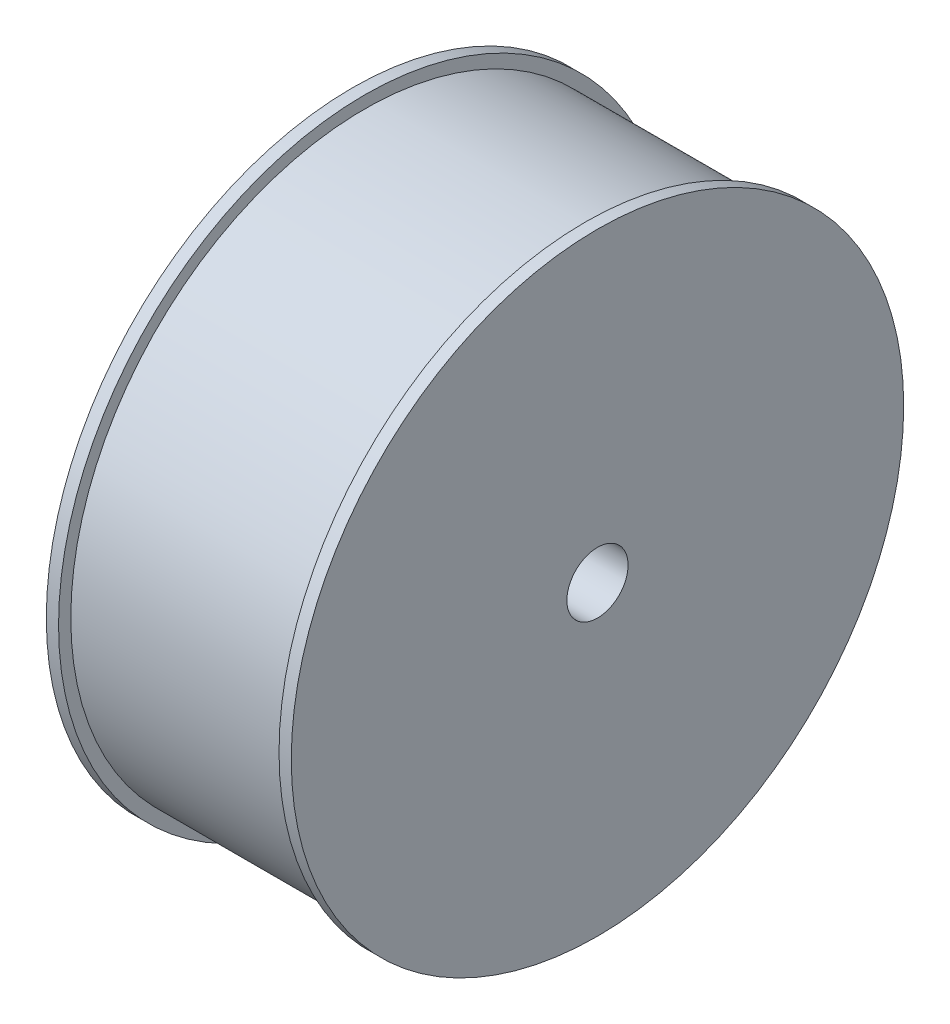
ISO-10303-21;
HEADER;
FILE_DESCRIPTION(('STEP AP214'),'2;1');
FILE_NAME('part.step','',(''),(''),'','','');
FILE_SCHEMA(('AUTOMOTIVE_DESIGN { 1 0 10303 214 1 1 1 1 }'));
ENDSEC;
DATA;
#1=APPLICATION_CONTEXT('core data for automotive mechanical design processes');
#2=APPLICATION_PROTOCOL_DEFINITION('international standard','automotive_design',2000,#1);
#3=PRODUCT_CONTEXT('',#1,'mechanical');
#4=PRODUCT('Part','Part','',(#3));
#5=PRODUCT_RELATED_PRODUCT_CATEGORY('part','',(#4));
#6=PRODUCT_DEFINITION_FORMATION('','',#4);
#7=PRODUCT_DEFINITION_CONTEXT('part definition',#1,'design');
#8=PRODUCT_DEFINITION('design','',#6,#7);
#9=PRODUCT_DEFINITION_SHAPE('','',#8);
#10=(LENGTH_UNIT() NAMED_UNIT(*) SI_UNIT(.MILLI.,.METRE.));
#11=(NAMED_UNIT(*) PLANE_ANGLE_UNIT() SI_UNIT($,.RADIAN.));
#12=(NAMED_UNIT(*) SI_UNIT($,.STERADIAN.) SOLID_ANGLE_UNIT());
#13=UNCERTAINTY_MEASURE_WITH_UNIT(LENGTH_MEASURE(1.E-05),#10,'distance_accuracy_value','');
#14=(GEOMETRIC_REPRESENTATION_CONTEXT(3) GLOBAL_UNCERTAINTY_ASSIGNED_CONTEXT((#13)) GLOBAL_UNIT_ASSIGNED_CONTEXT((#10,
#11,#12)) REPRESENTATION_CONTEXT('',''));
#15=CARTESIAN_POINT('',(0.,0.,0.));
#16=DIRECTION('',(0.,0.,1.));
#17=DIRECTION('',(1.,0.,0.));
#18=AXIS2_PLACEMENT_3D('',#15,#16,#17);
#19=CARTESIAN_POINT('',(-72.639673570566,0.,0.));
#20=DIRECTION('',(-1.,0.,0.));
#21=DIRECTION('',(0.,0.,1.));
#22=AXIS2_PLACEMENT_3D('',#19,#20,#21);
#23=CYLINDRICAL_SURFACE('',#22,12.5);
#24=CARTESIAN_POINT('',(50.,0.,0.));
#25=DIRECTION('',(-1.,0.,0.));
#26=DIRECTION('',(0.,0.,1.));
#27=AXIS2_PLACEMENT_3D('',#24,#25,#26);
#28=CIRCLE('',#27,12.5);
#29=CARTESIAN_POINT('',(50.,0.,12.5));
#30=VERTEX_POINT('',#29);
#31=EDGE_CURVE('E58',#30,#30,#28,.T.);
#32=ORIENTED_EDGE('',*,*,#31,.F.);
#33=EDGE_LOOP('',(#32));
#34=FACE_BOUND('',#33,.T.);
#35=CARTESIAN_POINT('',(-50.,0.,0.));
#36=DIRECTION('',(-1.,0.,0.));
#37=DIRECTION('',(0.,0.,1.));
#38=AXIS2_PLACEMENT_3D('',#35,#36,#37);
#39=CIRCLE('',#38,12.5);
#40=CARTESIAN_POINT('',(-50.,0.,12.5));
#41=VERTEX_POINT('',#40);
#42=EDGE_CURVE('E10',#41,#41,#39,.T.);
#43=ORIENTED_EDGE('',*,*,#42,.T.);
#44=EDGE_LOOP('',(#43));
#45=FACE_BOUND('',#44,.T.);
#46=ADVANCED_FACE('F30',(#34,#45),#23,.F.);
#47=CARTESIAN_POINT('',(-50.,12.5,0.));
#48=DIRECTION('',(1.,0.,0.));
#49=DIRECTION('',(0.,0.,-1.));
#50=AXIS2_PLACEMENT_3D('',#47,#48,#49);
#51=PLANE('',#50);
#52=ORIENTED_EDGE('',*,*,#42,.F.);
#53=EDGE_LOOP('',(#52));
#54=FACE_BOUND('',#53,.T.);
#55=CARTESIAN_POINT('',(-50.,0.,0.));
#56=DIRECTION('',(-1.,0.,0.));
#57=DIRECTION('',(0.,0.,1.));
#58=AXIS2_PLACEMENT_3D('',#55,#56,#57);
#59=CIRCLE('',#58,125.);
#60=CARTESIAN_POINT('',(-50.,0.,125.));
#61=VERTEX_POINT('',#60);
#62=EDGE_CURVE('E36',#61,#61,#59,.T.);
#63=ORIENTED_EDGE('',*,*,#62,.T.);
#64=EDGE_LOOP('',(#63));
#65=FACE_BOUND('',#64,.T.);
#66=ADVANCED_FACE('F65',(#54,#65),#51,.F.);
#67=CARTESIAN_POINT('',(-72.639673570566,0.,0.));
#68=DIRECTION('',(-1.,0.,0.));
#69=DIRECTION('',(0.,0.,1.));
#70=AXIS2_PLACEMENT_3D('',#67,#68,#69);
#71=CYLINDRICAL_SURFACE('',#70,125.);
#72=ORIENTED_EDGE('',*,*,#62,.F.);
#73=EDGE_LOOP('',(#72));
#74=FACE_BOUND('',#73,.T.);
#75=CARTESIAN_POINT('',(-45.,0.,0.));
#76=DIRECTION('',(-1.,0.,0.));
#77=DIRECTION('',(0.,0.,1.));
#78=AXIS2_PLACEMENT_3D('',#75,#76,#77);
#79=CIRCLE('',#78,125.);
#80=CARTESIAN_POINT('',(-45.,0.,125.));
#81=VERTEX_POINT('',#80);
#82=EDGE_CURVE('E40',#81,#81,#79,.T.);
#83=ORIENTED_EDGE('',*,*,#82,.T.);
#84=EDGE_LOOP('',(#83));
#85=FACE_BOUND('',#84,.T.);
#86=ADVANCED_FACE('F69',(#74,#85),#71,.T.);
#87=CARTESIAN_POINT('',(-45.,125.,0.));
#88=DIRECTION('',(-1.,0.,0.));
#89=DIRECTION('',(0.,0.,1.));
#90=AXIS2_PLACEMENT_3D('',#87,#88,#89);
#91=PLANE('',#90);
#92=ORIENTED_EDGE('',*,*,#82,.F.);
#93=EDGE_LOOP('',(#92));
#94=FACE_BOUND('',#93,.T.);
#95=CARTESIAN_POINT('',(-45.,0.,0.));
#96=DIRECTION('',(-1.,0.,0.));
#97=DIRECTION('',(0.,0.,1.));
#98=AXIS2_PLACEMENT_3D('',#95,#96,#97);
#99=CIRCLE('',#98,120.);
#100=CARTESIAN_POINT('',(-45.,0.,120.));
#101=VERTEX_POINT('',#100);
#102=EDGE_CURVE('E44',#101,#101,#99,.T.);
#103=ORIENTED_EDGE('',*,*,#102,.T.);
#104=EDGE_LOOP('',(#103));
#105=FACE_BOUND('',#104,.T.);
#106=ADVANCED_FACE('F74',(#94,#105),#91,.F.);
#107=CARTESIAN_POINT('',(-72.639673570566,0.,0.));
#108=DIRECTION('',(-1.,0.,0.));
#109=DIRECTION('',(0.,0.,1.));
#110=AXIS2_PLACEMENT_3D('',#107,#108,#109);
#111=CYLINDRICAL_SURFACE('',#110,120.);
#112=ORIENTED_EDGE('',*,*,#102,.F.);
#113=EDGE_LOOP('',(#112));
#114=FACE_BOUND('',#113,.T.);
#115=CARTESIAN_POINT('',(45.,0.,0.));
#116=DIRECTION('',(-1.,0.,0.));
#117=DIRECTION('',(0.,0.,1.));
#118=AXIS2_PLACEMENT_3D('',#115,#116,#117);
#119=CIRCLE('',#118,120.);
#120=CARTESIAN_POINT('',(45.,0.,120.));
#121=VERTEX_POINT('',#120);
#122=EDGE_CURVE('E49',#121,#121,#119,.T.);
#123=ORIENTED_EDGE('',*,*,#122,.T.);
#124=EDGE_LOOP('',(#123));
#125=FACE_BOUND('',#124,.T.);
#126=ADVANCED_FACE('F80',(#114,#125),#111,.T.);
#127=CARTESIAN_POINT('',(45.,120.,0.));
#128=DIRECTION('',(1.,0.,0.));
#129=DIRECTION('',(0.,0.,-1.));
#130=AXIS2_PLACEMENT_3D('',#127,#128,#129);
#131=PLANE('',#130);
#132=ORIENTED_EDGE('',*,*,#122,.F.);
#133=EDGE_LOOP('',(#132));
#134=FACE_BOUND('',#133,.T.);
#135=CARTESIAN_POINT('',(45.,0.,0.));
#136=DIRECTION('',(-1.,0.,0.));
#137=DIRECTION('',(0.,0.,1.));
#138=AXIS2_PLACEMENT_3D('',#135,#136,#137);
#139=CIRCLE('',#138,125.);
#140=CARTESIAN_POINT('',(45.,0.,125.));
#141=VERTEX_POINT('',#140);
#142=EDGE_CURVE('E52',#141,#141,#139,.T.);
#143=ORIENTED_EDGE('',*,*,#142,.T.);
#144=EDGE_LOOP('',(#143));
#145=FACE_BOUND('',#144,.T.);
#146=ADVANCED_FACE('F84',(#134,#145),#131,.F.);
#147=CARTESIAN_POINT('',(-72.639673570566,0.,0.));
#148=DIRECTION('',(-1.,0.,0.));
#149=DIRECTION('',(0.,0.,1.));
#150=AXIS2_PLACEMENT_3D('',#147,#148,#149);
#151=CYLINDRICAL_SURFACE('',#150,125.);
#152=ORIENTED_EDGE('',*,*,#142,.F.);
#153=EDGE_LOOP('',(#152));
#154=FACE_BOUND('',#153,.T.);
#155=CARTESIAN_POINT('',(50.,0.,0.));
#156=DIRECTION('',(-1.,0.,0.));
#157=DIRECTION('',(0.,0.,1.));
#158=AXIS2_PLACEMENT_3D('',#155,#156,#157);
#159=CIRCLE('',#158,125.);
#160=CARTESIAN_POINT('',(50.,0.,125.));
#161=VERTEX_POINT('',#160);
#162=EDGE_CURVE('E55',#161,#161,#159,.T.);
#163=ORIENTED_EDGE('',*,*,#162,.T.);
#164=EDGE_LOOP('',(#163));
#165=FACE_BOUND('',#164,.T.);
#166=ADVANCED_FACE('F88',(#154,#165),#151,.T.);
#167=CARTESIAN_POINT('',(50.,125.,0.));
#168=DIRECTION('',(-1.,0.,0.));
#169=DIRECTION('',(0.,0.,1.));
#170=AXIS2_PLACEMENT_3D('',#167,#168,#169);
#171=PLANE('',#170);
#172=ORIENTED_EDGE('',*,*,#162,.F.);
#173=EDGE_LOOP('',(#172));
#174=FACE_BOUND('',#173,.T.);
#175=ORIENTED_EDGE('',*,*,#31,.T.);
#176=EDGE_LOOP('',(#175));
#177=FACE_BOUND('',#176,.T.);
#178=ADVANCED_FACE('F62',(#174,#177),#171,.F.);
#179=CLOSED_SHELL('',(#46,#66,#86,#106,#126,#146,#166,#178));
#180=MANIFOLD_SOLID_BREP('B2',#179);
#181=ADVANCED_BREP_SHAPE_REPRESENTATION('',(#18,#180),#14);
#182=SHAPE_DEFINITION_REPRESENTATION(#9,#181);
ENDSEC;
END-ISO-10303-21;
